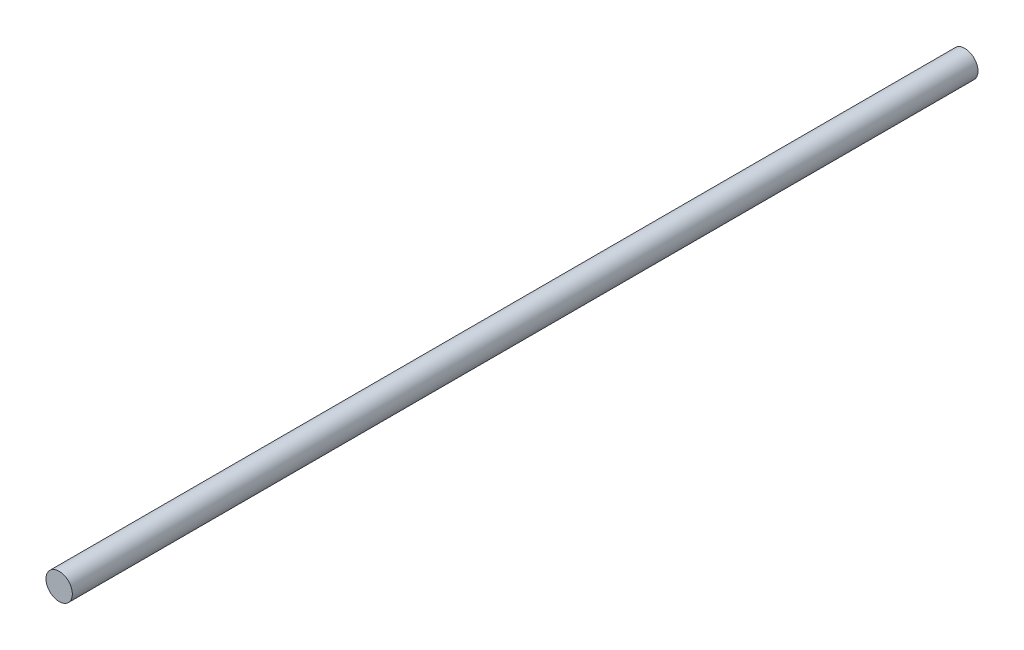
ISO-10303-21;
HEADER;
FILE_DESCRIPTION(('STEP AP214'),'2;1');
FILE_NAME('part.step','',(''),(''),'','','');
FILE_SCHEMA(('AUTOMOTIVE_DESIGN { 1 0 10303 214 1 1 1 1 }'));
ENDSEC;
DATA;
#1=APPLICATION_CONTEXT('core data for automotive mechanical design processes');
#2=APPLICATION_PROTOCOL_DEFINITION('international standard','automotive_design',2000,#1);
#3=PRODUCT_CONTEXT('',#1,'mechanical');
#4=PRODUCT('Part','Part','',(#3));
#5=PRODUCT_RELATED_PRODUCT_CATEGORY('part','',(#4));
#6=PRODUCT_DEFINITION_FORMATION('','',#4);
#7=PRODUCT_DEFINITION_CONTEXT('part definition',#1,'design');
#8=PRODUCT_DEFINITION('design','',#6,#7);
#9=PRODUCT_DEFINITION_SHAPE('','',#8);
#10=(LENGTH_UNIT() NAMED_UNIT(*) SI_UNIT(.MILLI.,.METRE.));
#11=(NAMED_UNIT(*) PLANE_ANGLE_UNIT() SI_UNIT($,.RADIAN.));
#12=(NAMED_UNIT(*) SI_UNIT($,.STERADIAN.) SOLID_ANGLE_UNIT());
#13=UNCERTAINTY_MEASURE_WITH_UNIT(LENGTH_MEASURE(1.E-05),#10,'distance_accuracy_value','');
#14=(GEOMETRIC_REPRESENTATION_CONTEXT(3) GLOBAL_UNCERTAINTY_ASSIGNED_CONTEXT((#13)) GLOBAL_UNIT_ASSIGNED_CONTEXT((#10,
#11,#12)) REPRESENTATION_CONTEXT('',''));
#15=CARTESIAN_POINT('',(0.,0.,0.));
#16=DIRECTION('',(0.,0.,1.));
#17=DIRECTION('',(1.,0.,0.));
#18=AXIS2_PLACEMENT_3D('',#15,#16,#17);
#19=CARTESIAN_POINT('',(0.,0.,550.));
#20=DIRECTION('',(0.,0.,-1.));
#21=DIRECTION('',(-1.,0.,0.));
#22=AXIS2_PLACEMENT_3D('',#19,#20,#21);
#23=CYLINDRICAL_SURFACE('',#22,8.);
#24=CARTESIAN_POINT('',(0.,0.,550.));
#25=DIRECTION('',(0.,0.,1.));
#26=DIRECTION('',(1.,0.,0.));
#27=AXIS2_PLACEMENT_3D('',#24,#25,#26);
#28=CIRCLE('',#27,8.);
#29=CARTESIAN_POINT('',(8.,0.,550.));
#30=VERTEX_POINT('',#29);
#31=EDGE_CURVE('E10',#30,#30,#28,.T.);
#32=ORIENTED_EDGE('',*,*,#31,.F.);
#33=EDGE_LOOP('',(#32));
#34=FACE_BOUND('',#33,.T.);
#35=CARTESIAN_POINT('',(0.,0.,0.));
#36=DIRECTION('',(0.,0.,1.));
#37=DIRECTION('',(1.,0.,0.));
#38=AXIS2_PLACEMENT_3D('',#35,#36,#37);
#39=CIRCLE('',#38,8.);
#40=CARTESIAN_POINT('',(8.,0.,0.));
#41=VERTEX_POINT('',#40);
#42=EDGE_CURVE('E40',#41,#41,#39,.T.);
#43=ORIENTED_EDGE('',*,*,#42,.T.);
#44=EDGE_LOOP('',(#43));
#45=FACE_BOUND('',#44,.T.);
#46=ADVANCED_FACE('F37',(#34,#45),#23,.T.);
#47=CARTESIAN_POINT('',(0.,0.,550.));
#48=DIRECTION('',(0.,0.,1.));
#49=DIRECTION('',(1.,0.,0.));
#50=AXIS2_PLACEMENT_3D('',#47,#48,#49);
#51=PLANE('',#50);
#52=ORIENTED_EDGE('',*,*,#31,.T.);
#53=EDGE_LOOP('',(#52));
#54=FACE_BOUND('',#53,.T.);
#55=ADVANCED_FACE('F54',(#54),#51,.T.);
#56=CARTESIAN_POINT('',(0.,0.,0.));
#57=DIRECTION('',(0.,0.,1.));
#58=DIRECTION('',(1.,0.,0.));
#59=AXIS2_PLACEMENT_3D('',#56,#57,#58);
#60=PLANE('',#59);
#61=ORIENTED_EDGE('',*,*,#42,.F.);
#62=EDGE_LOOP('',(#61));
#63=FACE_BOUND('',#62,.T.);
#64=ADVANCED_FACE('F52',(#63),#60,.F.);
#65=CLOSED_SHELL('',(#46,#55,#64));
#66=MANIFOLD_SOLID_BREP('B2',#65);
#67=ADVANCED_BREP_SHAPE_REPRESENTATION('',(#18,#66),#14);
#68=SHAPE_DEFINITION_REPRESENTATION(#9,#67);
ENDSEC;
END-ISO-10303-21;
